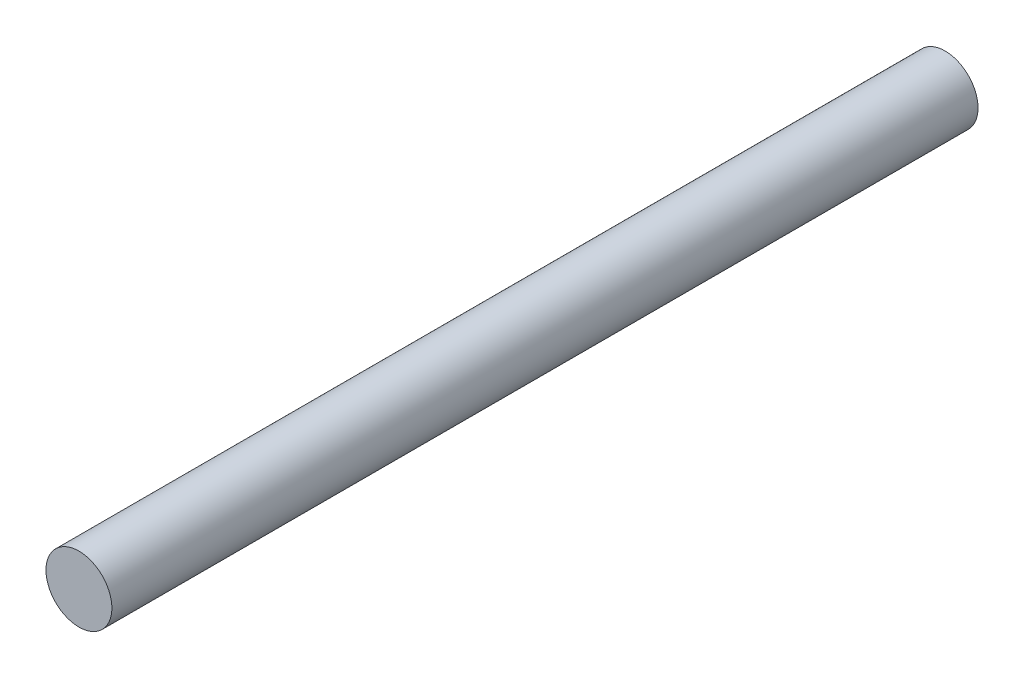
ISO-10303-21;
HEADER;
FILE_DESCRIPTION(('STEP AP214'),'2;1');
FILE_NAME('part.step','',(''),(''),'','','');
FILE_SCHEMA(('AUTOMOTIVE_DESIGN { 1 0 10303 214 1 1 1 1 }'));
ENDSEC;
DATA;
#1=APPLICATION_CONTEXT('core data for automotive mechanical design processes');
#2=APPLICATION_PROTOCOL_DEFINITION('international standard','automotive_design',2000,#1);
#3=PRODUCT_CONTEXT('',#1,'mechanical');
#4=PRODUCT('Part','Part','',(#3));
#5=PRODUCT_RELATED_PRODUCT_CATEGORY('part','',(#4));
#6=PRODUCT_DEFINITION_FORMATION('','',#4);
#7=PRODUCT_DEFINITION_CONTEXT('part definition',#1,'design');
#8=PRODUCT_DEFINITION('design','',#6,#7);
#9=PRODUCT_DEFINITION_SHAPE('','',#8);
#10=(LENGTH_UNIT() NAMED_UNIT(*) SI_UNIT(.MILLI.,.METRE.));
#11=(NAMED_UNIT(*) PLANE_ANGLE_UNIT() SI_UNIT($,.RADIAN.));
#12=(NAMED_UNIT(*) SI_UNIT($,.STERADIAN.) SOLID_ANGLE_UNIT());
#13=UNCERTAINTY_MEASURE_WITH_UNIT(LENGTH_MEASURE(1.E-05),#10,'distance_accuracy_value','');
#14=(GEOMETRIC_REPRESENTATION_CONTEXT(3) GLOBAL_UNCERTAINTY_ASSIGNED_CONTEXT((#13)) GLOBAL_UNIT_ASSIGNED_CONTEXT((#10,
#11,#12)) REPRESENTATION_CONTEXT('',''));
#15=CARTESIAN_POINT('',(0.,0.,0.));
#16=DIRECTION('',(0.,0.,1.));
#17=DIRECTION('',(1.,0.,0.));
#18=AXIS2_PLACEMENT_3D('',#15,#16,#17);
#19=CARTESIAN_POINT('',(0.,0.,41.75));
#20=DIRECTION('',(0.,0.,-1.));
#21=DIRECTION('',(-1.,0.,0.));
#22=AXIS2_PLACEMENT_3D('',#19,#20,#21);
#23=CYLINDRICAL_SURFACE('',#22,3.175);
#24=CARTESIAN_POINT('',(0.,0.,41.75));
#25=DIRECTION('',(0.,0.,1.));
#26=DIRECTION('',(1.,0.,0.));
#27=AXIS2_PLACEMENT_3D('',#24,#25,#26);
#28=CIRCLE('',#27,3.175);
#29=CARTESIAN_POINT('',(-3.175,0.,41.75));
#30=VERTEX_POINT('',#29);
#31=EDGE_CURVE('E10',#30,#30,#28,.T.);
#32=CARTESIAN_POINT('',(0.,0.,-41.75));
#33=DIRECTION('',(0.,0.,1.));
#34=DIRECTION('',(1.,0.,0.));
#35=AXIS2_PLACEMENT_3D('',#32,#33,#34);
#36=CIRCLE('',#35,3.175);
#37=CARTESIAN_POINT('',(-3.175,0.,-41.75));
#38=VERTEX_POINT('',#37);
#39=EDGE_CURVE('E44',#38,#38,#36,.T.);
#40=CARTESIAN_POINT('',(-3.175,0.,41.75));
#41=CARTESIAN_POINT('',(-3.175,0.,40.8802083333333));
#42=CARTESIAN_POINT('',(-3.175,0.,40.0104166666667));
#43=CARTESIAN_POINT('',(-3.175,0.,38.2708333333333));
#44=CARTESIAN_POINT('',(-3.175,0.,37.4010416666667));
#45=CARTESIAN_POINT('',(-3.175,0.,35.6614583333333));
#46=CARTESIAN_POINT('',(-3.175,0.,34.7916666666667));
#47=CARTESIAN_POINT('',(-3.175,0.,33.0520833333333));
#48=CARTESIAN_POINT('',(-3.175,0.,32.1822916666667));
#49=CARTESIAN_POINT('',(-3.175,0.,30.4427083333333));
#50=CARTESIAN_POINT('',(-3.175,0.,29.5729166666667));
#51=CARTESIAN_POINT('',(-3.175,0.,27.8333333333333));
#52=CARTESIAN_POINT('',(-3.175,0.,26.9635416666667));
#53=CARTESIAN_POINT('',(-3.175,0.,25.2239583333333));
#54=CARTESIAN_POINT('',(-3.175,0.,24.3541666666667));
#55=CARTESIAN_POINT('',(-3.175,0.,22.6145833333333));
#56=CARTESIAN_POINT('',(-3.175,0.,21.7447916666667));
#57=CARTESIAN_POINT('',(-3.175,0.,20.0052083333333));
#58=CARTESIAN_POINT('',(-3.175,0.,19.1354166666667));
#59=CARTESIAN_POINT('',(-3.175,0.,17.3958333333333));
#60=CARTESIAN_POINT('',(-3.175,0.,16.5260416666667));
#61=CARTESIAN_POINT('',(-3.175,0.,14.7864583333333));
#62=CARTESIAN_POINT('',(-3.175,0.,13.9166666666667));
#63=CARTESIAN_POINT('',(-3.175,0.,12.1770833333333));
#64=CARTESIAN_POINT('',(-3.175,0.,11.3072916666667));
#65=CARTESIAN_POINT('',(-3.175,0.,9.56770833333333));
#66=CARTESIAN_POINT('',(-3.175,0.,8.69791666666666));
#67=CARTESIAN_POINT('',(-3.175,0.,6.95833333333333));
#68=CARTESIAN_POINT('',(-3.175,0.,6.08854166666666));
#69=CARTESIAN_POINT('',(-3.175,0.,4.34895833333333));
#70=CARTESIAN_POINT('',(-3.175,0.,3.47916666666666));
#71=CARTESIAN_POINT('',(-3.175,0.,1.73958333333332));
#72=CARTESIAN_POINT('',(-3.175,0.,0.869791666666659));
#73=CARTESIAN_POINT('',(-3.175,0.,-0.869791666666673));
#74=CARTESIAN_POINT('',(-3.175,0.,-1.73958333333334));
#75=CARTESIAN_POINT('',(-3.175,0.,-3.47916666666667));
#76=CARTESIAN_POINT('',(-3.175,0.,-4.34895833333334));
#77=CARTESIAN_POINT('',(-3.175,0.,-6.08854166666668));
#78=CARTESIAN_POINT('',(-3.175,0.,-6.95833333333334));
#79=CARTESIAN_POINT('',(-3.175,0.,-8.69791666666668));
#80=CARTESIAN_POINT('',(-3.175,0.,-9.56770833333334));
#81=CARTESIAN_POINT('',(-3.175,0.,-11.3072916666667));
#82=CARTESIAN_POINT('',(-3.175,0.,-12.1770833333333));
#83=CARTESIAN_POINT('',(-3.175,0.,-13.9166666666667));
#84=CARTESIAN_POINT('',(-3.175,0.,-14.7864583333333));
#85=CARTESIAN_POINT('',(-3.175,0.,-16.5260416666667));
#86=CARTESIAN_POINT('',(-3.175,0.,-17.3958333333333));
#87=CARTESIAN_POINT('',(-3.175,0.,-19.1354166666667));
#88=CARTESIAN_POINT('',(-3.175,0.,-20.0052083333333));
#89=CARTESIAN_POINT('',(-3.175,0.,-21.7447916666667));
#90=CARTESIAN_POINT('',(-3.175,0.,-22.6145833333333));
#91=CARTESIAN_POINT('',(-3.175,0.,-24.3541666666667));
#92=CARTESIAN_POINT('',(-3.175,0.,-25.2239583333333));
#93=CARTESIAN_POINT('',(-3.175,0.,-26.9635416666667));
#94=CARTESIAN_POINT('',(-3.175,0.,-27.8333333333333));
#95=CARTESIAN_POINT('',(-3.175,0.,-29.5729166666667));
#96=CARTESIAN_POINT('',(-3.175,0.,-30.4427083333333));
#97=CARTESIAN_POINT('',(-3.175,0.,-32.1822916666667));
#98=CARTESIAN_POINT('',(-3.175,0.,-33.0520833333333));
#99=CARTESIAN_POINT('',(-3.175,0.,-34.7916666666667));
#100=CARTESIAN_POINT('',(-3.175,0.,-35.6614583333333));
#101=CARTESIAN_POINT('',(-3.175,0.,-37.4010416666667));
#102=CARTESIAN_POINT('',(-3.175,0.,-38.2708333333333));
#103=CARTESIAN_POINT('',(-3.175,0.,-40.0104166666667));
#104=CARTESIAN_POINT('',(-3.175,0.,-40.8802083333333));
#105=CARTESIAN_POINT('',(-3.175,0.,-41.75));
#106=B_SPLINE_CURVE_WITH_KNOTS('',3,(#40,#41,#42,#43,#44,#45,#46,#47,#48,#49,#50,#51,#52,#53,
#54,#55,#56,#57,#58,#59,#60,#61,#62,#63,#64,#65,#66,#67,#68,#69,#70,#71,#72,#73,#74,#75,#76,#77,
#78,#79,#80,#81,#82,#83,#84,#85,#86,#87,#88,#89,#90,#91,#92,#93,#94,#95,#96,#97,#98,#99,#100,
#101,#102,#103,#104,#105),.UNSPECIFIED.,.F.,.F.,(4,2,2,2,2,2,2,2,2,2,2,2,2,2,2,2,2,2,2,2,2,2,2,
2,2,2,2,2,2,2,2,2,4),(0.,2.609375,5.21874999999999,7.828125,10.4375,13.046875,15.65625,
18.265625,20.875,23.484375,26.09375,28.703125,31.3125,33.921875,36.53125,39.140625,41.75,
44.359375,46.96875,49.578125,52.1875,54.796875,57.40625,60.015625,62.625,65.234375,67.84375,
70.453125,73.0625,75.671875,78.28125,80.890625,83.5),.UNSPECIFIED.);
#107=EDGE_CURVE('BSEAM37',#30,#38,#106,.T.);
#108=ORIENTED_EDGE('',*,*,#31,.F.);
#109=ORIENTED_EDGE('',*,*,#39,.T.);
#110=ORIENTED_EDGE('',*,*,#107,.T.);
#111=ORIENTED_EDGE('',*,*,#107,.F.);
#112=EDGE_LOOP('',(#108,#110,#109,#111));
#113=FACE_BOUND('',#112,.T.);
#114=ADVANCED_FACE('F37',(#113),#23,.T.);
#115=CARTESIAN_POINT('',(0.,0.,41.75));
#116=DIRECTION('',(0.,0.,1.));
#117=DIRECTION('',(1.,0.,0.));
#118=AXIS2_PLACEMENT_3D('',#115,#116,#117);
#119=PLANE('',#118);
#120=ORIENTED_EDGE('',*,*,#31,.T.);
#121=EDGE_LOOP('',(#120));
#122=FACE_BOUND('',#121,.T.);
#123=ADVANCED_FACE('F54',(#122),#119,.T.);
#124=CARTESIAN_POINT('',(0.,0.,-41.75));
#125=DIRECTION('',(0.,0.,1.));
#126=DIRECTION('',(1.,0.,0.));
#127=AXIS2_PLACEMENT_3D('',#124,#125,#126);
#128=PLANE('',#127);
#129=ORIENTED_EDGE('',*,*,#39,.F.);
#130=EDGE_LOOP('',(#129));
#131=FACE_BOUND('',#130,.T.);
#132=ADVANCED_FACE('F52',(#131),#128,.F.);
#133=CLOSED_SHELL('',(#114,#123,#132));
#134=MANIFOLD_SOLID_BREP('B2',#133);
#135=ADVANCED_BREP_SHAPE_REPRESENTATION('',(#18,#134),#14);
#136=SHAPE_DEFINITION_REPRESENTATION(#9,#135);
ENDSEC;
END-ISO-10303-21;
